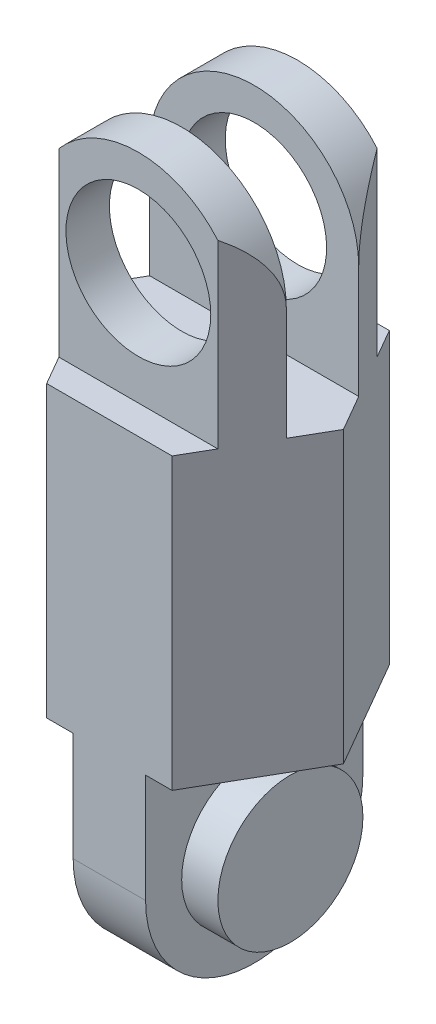
ISO-10303-21;
HEADER;
FILE_DESCRIPTION(('STEP AP214'),'2;1');
FILE_NAME('part.step','',(''),(''),'','','');
FILE_SCHEMA(('AUTOMOTIVE_DESIGN { 1 0 10303 214 1 1 1 1 }'));
ENDSEC;
DATA;
#1=APPLICATION_CONTEXT('core data for automotive mechanical design processes');
#2=APPLICATION_PROTOCOL_DEFINITION('international standard','automotive_design',2000,#1);
#3=PRODUCT_CONTEXT('',#1,'mechanical');
#4=PRODUCT('Part','Part','',(#3));
#5=PRODUCT_RELATED_PRODUCT_CATEGORY('part','',(#4));
#6=PRODUCT_DEFINITION_FORMATION('','',#4);
#7=PRODUCT_DEFINITION_CONTEXT('part definition',#1,'design');
#8=PRODUCT_DEFINITION('design','',#6,#7);
#9=PRODUCT_DEFINITION_SHAPE('','',#8);
#10=(LENGTH_UNIT() NAMED_UNIT(*) SI_UNIT(.MILLI.,.METRE.));
#11=(NAMED_UNIT(*) PLANE_ANGLE_UNIT() SI_UNIT($,.RADIAN.));
#12=(NAMED_UNIT(*) SI_UNIT($,.STERADIAN.) SOLID_ANGLE_UNIT());
#13=UNCERTAINTY_MEASURE_WITH_UNIT(LENGTH_MEASURE(1.E-05),#10,'distance_accuracy_value','');
#14=(GEOMETRIC_REPRESENTATION_CONTEXT(3) GLOBAL_UNCERTAINTY_ASSIGNED_CONTEXT((#13)) GLOBAL_UNIT_ASSIGNED_CONTEXT((#10,
#11,#12)) REPRESENTATION_CONTEXT('',''));
#15=CARTESIAN_POINT('',(0.,0.,0.));
#16=DIRECTION('',(0.,0.,1.));
#17=DIRECTION('',(1.,0.,0.));
#18=AXIS2_PLACEMENT_3D('',#15,#16,#17);
#19=CARTESIAN_POINT('',(-17.3205080756888,50.,11.));
#20=DIRECTION('',(0.,0.,-1.));
#21=DIRECTION('',(0.,1.,0.));
#22=AXIS2_PLACEMENT_3D('',#19,#20,#21);
#23=PLANE('',#22);
#24=CARTESIAN_POINT('',(0.,35.5662432702593,11.));
#25=DIRECTION('',(0.,0.,-1.));
#26=DIRECTION('',(0.,1.,0.));
#27=AXIS2_PLACEMENT_3D('',#24,#25,#26);
#28=CIRCLE('',#27,14.4337567297407);
#29=CARTESIAN_POINT('',(10.9696551146029,44.9470747899062,11.));
#30=VERTEX_POINT('',#29);
#31=CARTESIAN_POINT('',(-10.9696551146029,44.9470747899063,11.));
#32=VERTEX_POINT('',#31);
#33=EDGE_CURVE('E171',#30,#32,#28,.F.);
#34=ORIENTED_EDGE('',*,*,#33,.T.);
#35=DIRECTION('',(0.,1.,0.));
#36=VECTOR('',#35,1.);
#37=CARTESIAN_POINT('',(-10.9696551146029,50.,11.));
#38=LINE('',#37,#36);
#39=CARTESIAN_POINT('',(-10.9696551146029,20.,11.));
#40=VERTEX_POINT('',#39);
#41=EDGE_CURVE('E207',#40,#32,#38,.T.);
#42=ORIENTED_EDGE('',*,*,#41,.F.);
#43=DIRECTION('',(1.,0.,0.));
#44=VECTOR('',#43,1.);
#45=CARTESIAN_POINT('',(-17.3205080756888,20.,11.));
#46=LINE('',#45,#44);
#47=CARTESIAN_POINT('',(10.9696551146029,20.,11.));
#48=VERTEX_POINT('',#47);
#49=EDGE_CURVE('E382',#40,#48,#46,.T.);
#50=ORIENTED_EDGE('',*,*,#49,.T.);
#51=DIRECTION('',(0.,-1.,0.));
#52=VECTOR('',#51,1.);
#53=CARTESIAN_POINT('',(10.9696551146029,50.,11.));
#54=LINE('',#53,#52);
#55=EDGE_CURVE('E204',#30,#48,#54,.T.);
#56=ORIENTED_EDGE('',*,*,#55,.F.);
#57=EDGE_LOOP('',(#34,#42,#50,#56));
#58=FACE_BOUND('',#57,.T.);
#59=CARTESIAN_POINT('',(0.,35.5662432702593,11.));
#60=DIRECTION('',(0.,0.,-1.));
#61=DIRECTION('',(0.,1.,0.));
#62=AXIS2_PLACEMENT_3D('',#59,#60,#61);
#63=CIRCLE('',#62,10.);
#64=CARTESIAN_POINT('',(0.,45.5662432702593,11.));
#65=VERTEX_POINT('',#64);
#66=EDGE_CURVE('E408',#65,#65,#63,.T.);
#67=ORIENTED_EDGE('',*,*,#66,.T.);
#68=EDGE_LOOP('',(#67));
#69=FACE_BOUND('',#68,.T.);
#70=ADVANCED_FACE('F39',(#58,#69),#23,.F.);
#71=CARTESIAN_POINT('',(-17.3205080756888,50.,-11.0000000000001));
#72=DIRECTION('',(0.,0.,1.));
#73=DIRECTION('',(0.,-1.,0.));
#74=AXIS2_PLACEMENT_3D('',#71,#72,#73);
#75=PLANE('',#74);
#76=DIRECTION('',(0.,-1.,0.));
#77=VECTOR('',#76,1.);
#78=CARTESIAN_POINT('',(-10.9696551146029,50.,-11.0000000000001));
#79=LINE('',#78,#77);
#80=CARTESIAN_POINT('',(-10.9696551146029,44.9470747899062,-11.0000000000001));
#81=VERTEX_POINT('',#80);
#82=CARTESIAN_POINT('',(-10.9696551146029,20.,-11.0000000000001));
#83=VERTEX_POINT('',#82);
#84=EDGE_CURVE('E213',#81,#83,#79,.T.);
#85=ORIENTED_EDGE('',*,*,#84,.F.);
#86=CARTESIAN_POINT('',(0.,35.5662432702593,-11.0000000000001));
#87=DIRECTION('',(0.,0.,1.));
#88=DIRECTION('',(0.,-1.,0.));
#89=AXIS2_PLACEMENT_3D('',#86,#87,#88);
#90=CIRCLE('',#89,14.4337567297407);
#91=CARTESIAN_POINT('',(10.9696551146028,44.9470747899063,-11.0000000000001));
#92=VERTEX_POINT('',#91);
#93=EDGE_CURVE('E11',#81,#92,#90,.F.);
#94=ORIENTED_EDGE('',*,*,#93,.T.);
#95=DIRECTION('',(0.,1.,0.));
#96=VECTOR('',#95,1.);
#97=CARTESIAN_POINT('',(10.9696551146028,50.,-11.0000000000001));
#98=LINE('',#97,#96);
#99=CARTESIAN_POINT('',(10.9696551146028,20.,-11.0000000000001));
#100=VERTEX_POINT('',#99);
#101=EDGE_CURVE('E180',#100,#92,#98,.T.);
#102=ORIENTED_EDGE('',*,*,#101,.F.);
#103=DIRECTION('',(1.,0.,0.));
#104=VECTOR('',#103,1.);
#105=CARTESIAN_POINT('',(-17.3205080756888,20.,-11.0000000000001));
#106=LINE('',#105,#104);
#107=EDGE_CURVE('E395',#83,#100,#106,.T.);
#108=ORIENTED_EDGE('',*,*,#107,.F.);
#109=EDGE_LOOP('',(#85,#94,#102,#108));
#110=FACE_BOUND('',#109,.T.);
#111=CARTESIAN_POINT('',(0.,35.5662432702593,-11.0000000000001));
#112=DIRECTION('',(0.,0.,1.));
#113=DIRECTION('',(0.,-1.,0.));
#114=AXIS2_PLACEMENT_3D('',#111,#112,#113);
#115=CIRCLE('',#114,10.);
#116=CARTESIAN_POINT('',(0.,25.5662432702593,-11.0000000000001));
#117=VERTEX_POINT('',#116);
#118=EDGE_CURVE('E43',#117,#117,#115,.T.);
#119=ORIENTED_EDGE('',*,*,#118,.T.);
#120=EDGE_LOOP('',(#119));
#121=FACE_BOUND('',#120,.T.);
#122=ADVANCED_FACE('F432',(#110,#121),#75,.F.);
#123=CARTESIAN_POINT('',(-8.66025403784435,50.,15.));
#124=DIRECTION('',(0.,0.,-1.));
#125=DIRECTION('',(-1.,0.,0.));
#126=AXIS2_PLACEMENT_3D('',#123,#124,#125);
#127=PLANE('',#126);
#128=DIRECTION('',(0.,-1.,0.));
#129=VECTOR('',#128,1.);
#130=CARTESIAN_POINT('',(8.66025403784445,50.,15.));
#131=LINE('',#130,#129);
#132=CARTESIAN_POINT('',(8.66025403784445,20.,15.));
#133=VERTEX_POINT('',#132);
#134=CARTESIAN_POINT('',(8.66025403784445,-20.,15.));
#135=VERTEX_POINT('',#134);
#136=EDGE_CURVE('E324',#133,#135,#131,.T.);
#137=ORIENTED_EDGE('',*,*,#136,.F.);
#138=DIRECTION('',(1.,0.,0.));
#139=VECTOR('',#138,1.);
#140=CARTESIAN_POINT('',(-17.3205080756888,20.,15.));
#141=LINE('',#140,#139);
#142=CARTESIAN_POINT('',(-8.66025403784439,20.,15.));
#143=VERTEX_POINT('',#142);
#144=EDGE_CURVE('E357',#143,#133,#141,.T.);
#145=ORIENTED_EDGE('',*,*,#144,.F.);
#146=DIRECTION('',(0.,-1.,0.));
#147=VECTOR('',#146,1.);
#148=CARTESIAN_POINT('',(-8.66025403784435,50.,15.));
#149=LINE('',#148,#147);
#150=CARTESIAN_POINT('',(-8.66025403784435,-20.,15.));
#151=VERTEX_POINT('',#150);
#152=EDGE_CURVE('E327',#143,#151,#149,.T.);
#153=ORIENTED_EDGE('',*,*,#152,.T.);
#154=DIRECTION('',(-1.,0.,0.));
#155=VECTOR('',#154,1.);
#156=CARTESIAN_POINT('',(-17.3205080756888,-20.,15.));
#157=LINE('',#156,#155);
#158=CARTESIAN_POINT('',(-5.,-20.,15.));
#159=VERTEX_POINT('',#158);
#160=EDGE_CURVE('E266',#159,#151,#157,.T.);
#161=ORIENTED_EDGE('',*,*,#160,.F.);
#162=DIRECTION('',(0.,1.,0.));
#163=VECTOR('',#162,1.);
#164=CARTESIAN_POINT('',(-5.,-50.,15.));
#165=LINE('',#164,#163);
#166=CARTESIAN_POINT('',(-5.,-35.,15.));
#167=VERTEX_POINT('',#166);
#168=EDGE_CURVE('E263',#167,#159,#165,.T.);
#169=ORIENTED_EDGE('',*,*,#168,.F.);
#170=DIRECTION('',(1.,0.,0.));
#171=VECTOR('',#170,1.);
#172=CARTESIAN_POINT('',(-17.3205080756888,-35.,15.));
#173=LINE('',#172,#171);
#174=CARTESIAN_POINT('',(5.,-35.,15.));
#175=VERTEX_POINT('',#174);
#176=EDGE_CURVE('E63',#167,#175,#173,.T.);
#177=ORIENTED_EDGE('',*,*,#176,.T.);
#178=DIRECTION('',(0.,-1.,0.));
#179=VECTOR('',#178,1.);
#180=CARTESIAN_POINT('',(5.,-50.,15.));
#181=LINE('',#180,#179);
#182=CARTESIAN_POINT('',(5.,-20.,15.));
#183=VERTEX_POINT('',#182);
#184=EDGE_CURVE('E285',#183,#175,#181,.T.);
#185=ORIENTED_EDGE('',*,*,#184,.F.);
#186=DIRECTION('',(-1.,0.,0.));
#187=VECTOR('',#186,1.);
#188=CARTESIAN_POINT('',(17.3205080756888,-20.,15.));
#189=LINE('',#188,#187);
#190=EDGE_CURVE('E262',#135,#183,#189,.T.);
#191=ORIENTED_EDGE('',*,*,#190,.F.);
#192=EDGE_LOOP('',(#137,#145,#153,#161,#169,#177,#185,#191));
#193=FACE_BOUND('',#192,.T.);
#194=ADVANCED_FACE('F356',(#193),#127,.F.);
#195=CARTESIAN_POINT('',(-8.66025403784456,50.,-14.9999999999999));
#196=DIRECTION('',(0.866025403784442,0.,0.499999999999995));
#197=DIRECTION('',(0.499999999999995,0.,-0.866025403784441));
#198=AXIS2_PLACEMENT_3D('',#195,#196,#197);
#199=PLANE('',#198);
#200=DIRECTION('',(0.,1.,0.));
#201=VECTOR('',#200,1.);
#202=CARTESIAN_POINT('',(-14.4337567297406,50.,-5.00000000000012));
#203=LINE('',#202,#201);
#204=CARTESIAN_POINT('',(-14.4337567297406,20.,-5.00000000000012));
#205=VERTEX_POINT('',#204);
#206=CARTESIAN_POINT('',(-14.4337567297407,35.5662432702593,-5.00000000000012));
#207=VERTEX_POINT('',#206);
#208=EDGE_CURVE('E188',#205,#207,#203,.T.);
#209=ORIENTED_EDGE('',*,*,#208,.T.);
#210=CARTESIAN_POINT('',(0.,35.5662432702593,-30.0000000000004));
#211=DIRECTION('',(0.866025403784442,0.,0.499999999999995));
#212=DIRECTION('',(-0.499999999999995,0.,0.866025403784441));
#213=AXIS2_PLACEMENT_3D('',#210,#211,#212);
#214=ELLIPSE('',#213,28.8675134594817,14.4337567297407);
#215=EDGE_CURVE('E166',#207,#81,#214,.F.);
#216=ORIENTED_EDGE('',*,*,#215,.T.);
#217=ORIENTED_EDGE('',*,*,#84,.T.);
#218=DIRECTION('',(0.499999999999995,0.,-0.866025403784441));
#219=VECTOR('',#218,1.);
#220=CARTESIAN_POINT('',(-8.66025403784456,20.,-14.9999999999999));
#221=LINE('',#220,#219);
#222=CARTESIAN_POINT('',(-8.66025403784456,20.,-15.0000000000001));
#223=VERTEX_POINT('',#222);
#224=EDGE_CURVE('E219',#83,#223,#221,.T.);
#225=ORIENTED_EDGE('',*,*,#224,.T.);
#226=DIRECTION('',(0.,-1.,0.));
#227=VECTOR('',#226,1.);
#228=CARTESIAN_POINT('',(-8.66025403784456,50.,-14.9999999999999));
#229=LINE('',#228,#227);
#230=CARTESIAN_POINT('',(-8.66025403784456,-20.,-15.0000000000001));
#231=VERTEX_POINT('',#230);
#232=EDGE_CURVE('E315',#223,#231,#229,.T.);
#233=ORIENTED_EDGE('',*,*,#232,.T.);
#234=DIRECTION('',(-0.499999999999995,0.,0.866025403784442));
#235=VECTOR('',#234,1.);
#236=CARTESIAN_POINT('',(-8.66025403784456,-20.,-14.9999999999999));
#237=LINE('',#236,#235);
#238=CARTESIAN_POINT('',(-17.3205080756888,-20.,0.));
#239=VERTEX_POINT('',#238);
#240=EDGE_CURVE('E311',#231,#239,#237,.T.);
#241=ORIENTED_EDGE('',*,*,#240,.T.);
#242=DIRECTION('',(0.,-1.,0.));
#243=VECTOR('',#242,1.);
#244=CARTESIAN_POINT('',(-17.3205080756888,50.,0.));
#245=LINE('',#244,#243);
#246=CARTESIAN_POINT('',(-17.3205080756888,20.,0.));
#247=VERTEX_POINT('',#246);
#248=EDGE_CURVE('E330',#247,#239,#245,.T.);
#249=ORIENTED_EDGE('',*,*,#248,.F.);
#250=DIRECTION('',(0.499999999999995,0.,-0.866025403784441));
#251=VECTOR('',#250,1.);
#252=CARTESIAN_POINT('',(-8.66025403784456,20.,-14.9999999999999));
#253=LINE('',#252,#251);
#254=EDGE_CURVE('E231',#247,#205,#253,.T.);
#255=ORIENTED_EDGE('',*,*,#254,.T.);
#256=EDGE_LOOP('',(#209,#216,#217,#225,#233,#241,#249,#255));
#257=FACE_BOUND('',#256,.T.);
#258=ADVANCED_FACE('F41',(#257),#199,.F.);
#259=CARTESIAN_POINT('',(-17.3205080756888,50.,0.));
#260=DIRECTION('',(0.866025403784438,0.,-0.500000000000001));
#261=DIRECTION('',(-0.500000000000001,0.,-0.866025403784438));
#262=AXIS2_PLACEMENT_3D('',#259,#260,#261);
#263=PLANE('',#262);
#264=ORIENTED_EDGE('',*,*,#41,.T.);
#265=CARTESIAN_POINT('',(0.,35.5662432702593,29.9999999999999));
#266=DIRECTION('',(0.866025403784438,0.,-0.500000000000001));
#267=DIRECTION('',(0.500000000000001,0.,0.866025403784438));
#268=AXIS2_PLACEMENT_3D('',#265,#266,#267);
#269=ELLIPSE('',#268,28.8675134594813,14.4337567297407);
#270=CARTESIAN_POINT('',(-14.4337567297407,35.5662432702593,4.99999999999988));
#271=VERTEX_POINT('',#270);
#272=EDGE_CURVE('E419',#32,#271,#269,.F.);
#273=ORIENTED_EDGE('',*,*,#272,.T.);
#274=DIRECTION('',(0.,-1.,0.));
#275=VECTOR('',#274,1.);
#276=CARTESIAN_POINT('',(-14.4337567297407,50.,4.99999999999988));
#277=LINE('',#276,#275);
#278=CARTESIAN_POINT('',(-14.4337567297407,20.,4.99999999999988));
#279=VERTEX_POINT('',#278);
#280=EDGE_CURVE('E201',#271,#279,#277,.T.);
#281=ORIENTED_EDGE('',*,*,#280,.T.);
#282=DIRECTION('',(-0.500000000000001,0.,-0.866025403784438));
#283=VECTOR('',#282,1.);
#284=CARTESIAN_POINT('',(-17.3205080756888,20.,0.));
#285=LINE('',#284,#283);
#286=EDGE_CURVE('E227',#279,#247,#285,.T.);
#287=ORIENTED_EDGE('',*,*,#286,.T.);
#288=ORIENTED_EDGE('',*,*,#248,.T.);
#289=DIRECTION('',(0.500000000000001,0.,0.866025403784438));
#290=VECTOR('',#289,1.);
#291=CARTESIAN_POINT('',(-17.3205080756888,-20.,0.));
#292=LINE('',#291,#290);
#293=EDGE_CURVE('E307',#239,#151,#292,.T.);
#294=ORIENTED_EDGE('',*,*,#293,.T.);
#295=ORIENTED_EDGE('',*,*,#152,.F.);
#296=DIRECTION('',(-0.500000000000001,0.,-0.866025403784438));
#297=VECTOR('',#296,1.);
#298=CARTESIAN_POINT('',(-17.3205080756888,20.,0.));
#299=LINE('',#298,#297);
#300=EDGE_CURVE('E235',#143,#40,#299,.T.);
#301=ORIENTED_EDGE('',*,*,#300,.T.);
#302=EDGE_LOOP('',(#264,#273,#281,#287,#288,#294,#295,#301));
#303=FACE_BOUND('',#302,.T.);
#304=ADVANCED_FACE('F508',(#303),#263,.F.);
#305=CARTESIAN_POINT('',(8.66025403784445,50.,15.));
#306=DIRECTION('',(-0.866025403784442,0.,-0.499999999999995));
#307=DIRECTION('',(-0.499999999999995,0.,0.866025403784442));
#308=AXIS2_PLACEMENT_3D('',#305,#306,#307);
#309=PLANE('',#308);
#310=DIRECTION('',(0.,1.,0.));
#311=VECTOR('',#310,1.);
#312=CARTESIAN_POINT('',(14.4337567297407,50.,4.99999999999988));
#313=LINE('',#312,#311);
#314=CARTESIAN_POINT('',(14.4337567297407,20.,4.99999999999988));
#315=VERTEX_POINT('',#314);
#316=CARTESIAN_POINT('',(14.4337567297407,35.5662432702593,4.99999999999988));
#317=VERTEX_POINT('',#316);
#318=EDGE_CURVE('E192',#315,#317,#313,.T.);
#319=ORIENTED_EDGE('',*,*,#318,.T.);
#320=CARTESIAN_POINT('',(0.,35.5662432702593,30.0000000000003));
#321=DIRECTION('',(-0.866025403784442,0.,-0.499999999999995));
#322=DIRECTION('',(-0.499999999999995,0.,0.866025403784442));
#323=AXIS2_PLACEMENT_3D('',#320,#321,#322);
#324=ELLIPSE('',#323,28.8675134594817,14.4337567297407);
#325=EDGE_CURVE('E423',#317,#30,#324,.F.);
#326=ORIENTED_EDGE('',*,*,#325,.T.);
#327=ORIENTED_EDGE('',*,*,#55,.T.);
#328=DIRECTION('',(-0.499999999999995,0.,0.866025403784442));
#329=VECTOR('',#328,1.);
#330=CARTESIAN_POINT('',(8.66025403784445,20.,15.));
#331=LINE('',#330,#329);
#332=EDGE_CURVE('E49',#48,#133,#331,.T.);
#333=ORIENTED_EDGE('',*,*,#332,.T.);
#334=ORIENTED_EDGE('',*,*,#136,.T.);
#335=DIRECTION('',(0.499999999999995,0.,-0.866025403784442));
#336=VECTOR('',#335,1.);
#337=CARTESIAN_POINT('',(8.66025403784445,-20.,15.));
#338=LINE('',#337,#336);
#339=CARTESIAN_POINT('',(17.3205080756888,-20.,-1.24406136667926E-13));
#340=VERTEX_POINT('',#339);
#341=EDGE_CURVE('E303',#135,#340,#338,.T.);
#342=ORIENTED_EDGE('',*,*,#341,.T.);
#343=DIRECTION('',(0.,-1.,0.));
#344=VECTOR('',#343,1.);
#345=CARTESIAN_POINT('',(17.3205080756888,50.,-1.20948461451098E-13));
#346=LINE('',#345,#344);
#347=CARTESIAN_POINT('',(17.3205080756888,20.,-1.20563281580388E-13));
#348=VERTEX_POINT('',#347);
#349=EDGE_CURVE('E321',#348,#340,#346,.T.);
#350=ORIENTED_EDGE('',*,*,#349,.F.);
#351=DIRECTION('',(-0.499999999999995,0.,0.866025403784442));
#352=VECTOR('',#351,1.);
#353=CARTESIAN_POINT('',(8.66025403784445,20.,15.));
#354=LINE('',#353,#352);
#355=EDGE_CURVE('E223',#348,#315,#354,.T.);
#356=ORIENTED_EDGE('',*,*,#355,.T.);
#357=EDGE_LOOP('',(#319,#326,#327,#333,#334,#342,#350,#356));
#358=FACE_BOUND('',#357,.T.);
#359=ADVANCED_FACE('F346',(#358),#309,.F.);
#360=CARTESIAN_POINT('',(17.3205080756888,50.,-1.20948461451098E-13));
#361=DIRECTION('',(-0.866025403784435,0.,0.500000000000007));
#362=DIRECTION('',(0.500000000000007,0.,0.866025403784435));
#363=AXIS2_PLACEMENT_3D('',#360,#361,#362);
#364=PLANE('',#363);
#365=ORIENTED_EDGE('',*,*,#101,.T.);
#366=CARTESIAN_POINT('',(0.,35.5662432702593,-29.9999999999996));
#367=DIRECTION('',(-0.866025403784435,0.,0.500000000000007));
#368=DIRECTION('',(0.500000000000007,0.,0.866025403784435));
#369=AXIS2_PLACEMENT_3D('',#366,#367,#368);
#370=ELLIPSE('',#369,28.867513459481,14.4337567297407);
#371=CARTESIAN_POINT('',(14.4337567297407,35.5662432702593,-5.00000000000012));
#372=VERTEX_POINT('',#371);
#373=EDGE_CURVE('E56',#92,#372,#370,.F.);
#374=ORIENTED_EDGE('',*,*,#373,.T.);
#375=DIRECTION('',(0.,-1.,0.));
#376=VECTOR('',#375,1.);
#377=CARTESIAN_POINT('',(14.4337567297406,50.,-5.00000000000012));
#378=LINE('',#377,#376);
#379=CARTESIAN_POINT('',(14.4337567297406,20.,-5.00000000000012));
#380=VERTEX_POINT('',#379);
#381=EDGE_CURVE('E177',#372,#380,#378,.T.);
#382=ORIENTED_EDGE('',*,*,#381,.T.);
#383=DIRECTION('',(0.500000000000007,0.,0.866025403784435));
#384=VECTOR('',#383,1.);
#385=CARTESIAN_POINT('',(17.3205080756888,20.,-1.20948461451098E-13));
#386=LINE('',#385,#384);
#387=EDGE_CURVE('E251',#380,#348,#386,.T.);
#388=ORIENTED_EDGE('',*,*,#387,.T.);
#389=ORIENTED_EDGE('',*,*,#349,.T.);
#390=DIRECTION('',(-0.500000000000007,0.,-0.866025403784435));
#391=VECTOR('',#390,1.);
#392=CARTESIAN_POINT('',(17.3205080756888,-20.,-1.20948461451098E-13));
#393=LINE('',#392,#391);
#394=CARTESIAN_POINT('',(8.66025403784424,-20.,-15.0000000000001));
#395=VERTEX_POINT('',#394);
#396=EDGE_CURVE('E282',#340,#395,#393,.T.);
#397=ORIENTED_EDGE('',*,*,#396,.T.);
#398=DIRECTION('',(0.,-1.,0.));
#399=VECTOR('',#398,1.);
#400=CARTESIAN_POINT('',(8.66025403784424,50.,-15.0000000000001));
#401=LINE('',#400,#399);
#402=CARTESIAN_POINT('',(8.66025403784424,20.,-15.0000000000001));
#403=VERTEX_POINT('',#402);
#404=EDGE_CURVE('E318',#403,#395,#401,.T.);
#405=ORIENTED_EDGE('',*,*,#404,.F.);
#406=DIRECTION('',(0.500000000000007,0.,0.866025403784435));
#407=VECTOR('',#406,1.);
#408=CARTESIAN_POINT('',(17.3205080756888,20.,-1.20948461451098E-13));
#409=LINE('',#408,#407);
#410=EDGE_CURVE('E216',#403,#100,#409,.T.);
#411=ORIENTED_EDGE('',*,*,#410,.T.);
#412=EDGE_LOOP('',(#365,#374,#382,#388,#389,#397,#405,#411));
#413=FACE_BOUND('',#412,.T.);
#414=ADVANCED_FACE('F175',(#413),#364,.F.);
#415=CARTESIAN_POINT('',(8.66025403784424,50.,-15.0000000000001));
#416=DIRECTION('',(0.,0.,1.));
#417=DIRECTION('',(1.,0.,0.));
#418=AXIS2_PLACEMENT_3D('',#415,#416,#417);
#419=PLANE('',#418);
#420=ORIENTED_EDGE('',*,*,#232,.F.);
#421=DIRECTION('',(1.,0.,0.));
#422=VECTOR('',#421,1.);
#423=CARTESIAN_POINT('',(-17.3205080756888,20.,-15.0000000000001));
#424=LINE('',#423,#422);
#425=EDGE_CURVE('E387',#223,#403,#424,.T.);
#426=ORIENTED_EDGE('',*,*,#425,.T.);
#427=ORIENTED_EDGE('',*,*,#404,.T.);
#428=DIRECTION('',(-1.,0.,0.));
#429=VECTOR('',#428,1.);
#430=CARTESIAN_POINT('',(17.3205080756888,-20.,-15.0000000000001));
#431=LINE('',#430,#429);
#432=CARTESIAN_POINT('',(5.,-20.,-15.0000000000001));
#433=VERTEX_POINT('',#432);
#434=EDGE_CURVE('E289',#395,#433,#431,.T.);
#435=ORIENTED_EDGE('',*,*,#434,.T.);
#436=DIRECTION('',(0.,-1.,0.));
#437=VECTOR('',#436,1.);
#438=CARTESIAN_POINT('',(5.,-50.,-15.0000000000001));
#439=LINE('',#438,#437);
#440=CARTESIAN_POINT('',(5.,-35.,-15.0000000000001));
#441=VERTEX_POINT('',#440);
#442=EDGE_CURVE('E293',#433,#441,#439,.T.);
#443=ORIENTED_EDGE('',*,*,#442,.T.);
#444=DIRECTION('',(1.,0.,0.));
#445=VECTOR('',#444,1.);
#446=CARTESIAN_POINT('',(-17.3205080756888,-35.,-15.0000000000001));
#447=LINE('',#446,#445);
#448=CARTESIAN_POINT('',(-5.,-35.,-15.0000000000001));
#449=VERTEX_POINT('',#448);
#450=EDGE_CURVE('E253',#449,#441,#447,.T.);
#451=ORIENTED_EDGE('',*,*,#450,.F.);
#452=DIRECTION('',(0.,1.,0.));
#453=VECTOR('',#452,1.);
#454=CARTESIAN_POINT('',(-5.,-50.,-15.0000000000001));
#455=LINE('',#454,#453);
#456=CARTESIAN_POINT('',(-5.,-20.,-15.0000000000001));
#457=VERTEX_POINT('',#456);
#458=EDGE_CURVE('E271',#449,#457,#455,.T.);
#459=ORIENTED_EDGE('',*,*,#458,.T.);
#460=DIRECTION('',(-1.,0.,0.));
#461=VECTOR('',#460,1.);
#462=CARTESIAN_POINT('',(-17.3205080756888,-20.,-15.0000000000001));
#463=LINE('',#462,#461);
#464=EDGE_CURVE('E274',#457,#231,#463,.T.);
#465=ORIENTED_EDGE('',*,*,#464,.T.);
#466=EDGE_LOOP('',(#420,#426,#427,#435,#443,#451,#459,#465));
#467=FACE_BOUND('',#466,.T.);
#468=ADVANCED_FACE('F370',(#467),#419,.F.);
#469=CARTESIAN_POINT('',(17.3205080756888,-20.,-15.0000000000001));
#470=DIRECTION('',(0.,1.,0.));
#471=DIRECTION('',(0.,0.,1.));
#472=AXIS2_PLACEMENT_3D('',#469,#470,#471);
#473=PLANE('',#472);
#474=ORIENTED_EDGE('',*,*,#190,.T.);
#475=DIRECTION('',(0.,0.,1.));
#476=VECTOR('',#475,1.);
#477=CARTESIAN_POINT('',(5.,-20.,-15.0000000000001));
#478=LINE('',#477,#476);
#479=EDGE_CURVE('E267',#433,#183,#478,.T.);
#480=ORIENTED_EDGE('',*,*,#479,.F.);
#481=ORIENTED_EDGE('',*,*,#434,.F.);
#482=ORIENTED_EDGE('',*,*,#396,.F.);
#483=ORIENTED_EDGE('',*,*,#341,.F.);
#484=EDGE_LOOP('',(#474,#480,#481,#482,#483));
#485=FACE_BOUND('',#484,.T.);
#486=ADVANCED_FACE('F361',(#485),#473,.F.);
#487=CARTESIAN_POINT('',(5.,-50.,-15.0000000000001));
#488=DIRECTION('',(-1.,0.,0.));
#489=DIRECTION('',(0.,0.,1.));
#490=AXIS2_PLACEMENT_3D('',#487,#488,#489);
#491=PLANE('',#490);
#492=CARTESIAN_POINT('',(5.,-35.,0.));
#493=DIRECTION('',(-1.,0.,0.));
#494=DIRECTION('',(0.,0.,1.));
#495=AXIS2_PLACEMENT_3D('',#492,#493,#494);
#496=CIRCLE('',#495,10.015435759768);
#497=CARTESIAN_POINT('',(5.,-35.,10.0154357597679));
#498=VERTEX_POINT('',#497);
#499=EDGE_CURVE('E247',#498,#498,#496,.F.);
#500=ORIENTED_EDGE('',*,*,#499,.F.);
#501=EDGE_LOOP('',(#500));
#502=FACE_BOUND('',#501,.T.);
#503=ORIENTED_EDGE('',*,*,#184,.T.);
#504=CARTESIAN_POINT('',(5.,-35.,0.));
#505=DIRECTION('',(-1.,0.,0.));
#506=DIRECTION('',(0.,0.,1.));
#507=AXIS2_PLACEMENT_3D('',#504,#505,#506);
#508=CIRCLE('',#507,15.);
#509=EDGE_CURVE('E257',#175,#441,#508,.F.);
#510=ORIENTED_EDGE('',*,*,#509,.T.);
#511=ORIENTED_EDGE('',*,*,#442,.F.);
#512=ORIENTED_EDGE('',*,*,#479,.T.);
#513=EDGE_LOOP('',(#503,#510,#511,#512));
#514=FACE_BOUND('',#513,.T.);
#515=ADVANCED_FACE('F366',(#502,#514),#491,.F.);
#516=CARTESIAN_POINT('',(-17.3205080756888,-20.,-15.0000000000001));
#517=DIRECTION('',(0.,1.,0.));
#518=DIRECTION('',(0.,0.,1.));
#519=AXIS2_PLACEMENT_3D('',#516,#517,#518);
#520=PLANE('',#519);
#521=ORIENTED_EDGE('',*,*,#464,.F.);
#522=DIRECTION('',(0.,0.,1.));
#523=VECTOR('',#522,1.);
#524=CARTESIAN_POINT('',(-5.,-20.,-15.0000000000001));
#525=LINE('',#524,#523);
#526=EDGE_CURVE('E278',#457,#159,#525,.T.);
#527=ORIENTED_EDGE('',*,*,#526,.T.);
#528=ORIENTED_EDGE('',*,*,#160,.T.);
#529=ORIENTED_EDGE('',*,*,#293,.F.);
#530=ORIENTED_EDGE('',*,*,#240,.F.);
#531=EDGE_LOOP('',(#521,#527,#528,#529,#530));
#532=FACE_BOUND('',#531,.T.);
#533=ADVANCED_FACE('F490',(#532),#520,.F.);
#534=CARTESIAN_POINT('',(-5.,-50.,-15.0000000000001));
#535=DIRECTION('',(1.,0.,0.));
#536=DIRECTION('',(0.,0.,-1.));
#537=AXIS2_PLACEMENT_3D('',#534,#535,#536);
#538=PLANE('',#537);
#539=CARTESIAN_POINT('',(-5.,-35.,0.));
#540=DIRECTION('',(1.,0.,0.));
#541=DIRECTION('',(0.,0.,-1.));
#542=AXIS2_PLACEMENT_3D('',#539,#540,#541);
#543=CIRCLE('',#542,10.015435759768);
#544=CARTESIAN_POINT('',(-5.,-35.,-10.015435759768));
#545=VERTEX_POINT('',#544);
#546=EDGE_CURVE('E252',#545,#545,#543,.F.);
#547=ORIENTED_EDGE('',*,*,#546,.F.);
#548=EDGE_LOOP('',(#547));
#549=FACE_BOUND('',#548,.T.);
#550=ORIENTED_EDGE('',*,*,#458,.F.);
#551=CARTESIAN_POINT('',(-5.,-35.,0.));
#552=DIRECTION('',(1.,0.,0.));
#553=DIRECTION('',(0.,0.,-1.));
#554=AXIS2_PLACEMENT_3D('',#551,#552,#553);
#555=CIRCLE('',#554,15.);
#556=EDGE_CURVE('E333',#449,#167,#555,.F.);
#557=ORIENTED_EDGE('',*,*,#556,.T.);
#558=ORIENTED_EDGE('',*,*,#168,.T.);
#559=ORIENTED_EDGE('',*,*,#526,.F.);
#560=EDGE_LOOP('',(#550,#557,#558,#559));
#561=FACE_BOUND('',#560,.T.);
#562=ADVANCED_FACE('F489',(#549,#561),#538,.F.);
#563=CARTESIAN_POINT('',(-17.3205080756888,-35.,0.));
#564=DIRECTION('',(1.,0.,0.));
#565=DIRECTION('',(0.,0.,-1.));
#566=AXIS2_PLACEMENT_3D('',#563,#564,#565);
#567=CYLINDRICAL_SURFACE('',#566,15.);
#568=ORIENTED_EDGE('',*,*,#509,.F.);
#569=ORIENTED_EDGE('',*,*,#176,.F.);
#570=ORIENTED_EDGE('',*,*,#556,.F.);
#571=ORIENTED_EDGE('',*,*,#450,.T.);
#572=EDGE_LOOP('',(#568,#569,#570,#571));
#573=FACE_BOUND('',#572,.T.);
#574=ADVANCED_FACE('F482',(#573),#567,.T.);
#575=CARTESIAN_POINT('',(-10.,-35.,0.));
#576=DIRECTION('',(1.,0.,0.));
#577=DIRECTION('',(0.,0.,-1.));
#578=AXIS2_PLACEMENT_3D('',#575,#576,#577);
#579=PLANE('',#578);
#580=CARTESIAN_POINT('',(-10.,-35.,0.));
#581=DIRECTION('',(1.,0.,0.));
#582=DIRECTION('',(0.,0.,-1.));
#583=AXIS2_PLACEMENT_3D('',#580,#581,#582);
#584=CIRCLE('',#583,10.015435759768);
#585=CARTESIAN_POINT('',(-10.,-35.,-10.015435759768));
#586=VERTEX_POINT('',#585);
#587=EDGE_CURVE('E239',#586,#586,#584,.T.);
#588=ORIENTED_EDGE('',*,*,#587,.F.);
#589=EDGE_LOOP('',(#588));
#590=FACE_BOUND('',#589,.T.);
#591=ADVANCED_FACE('F478',(#590),#579,.F.);
#592=CARTESIAN_POINT('',(10.,-35.,0.));
#593=DIRECTION('',(-1.,0.,0.));
#594=DIRECTION('',(0.,0.,1.));
#595=AXIS2_PLACEMENT_3D('',#592,#593,#594);
#596=CYLINDRICAL_SURFACE('',#595,10.015435759768);
#597=ORIENTED_EDGE('',*,*,#587,.T.);
#598=EDGE_LOOP('',(#597));
#599=FACE_BOUND('',#598,.T.);
#600=ORIENTED_EDGE('',*,*,#546,.T.);
#601=EDGE_LOOP('',(#600));
#602=FACE_BOUND('',#601,.T.);
#603=ADVANCED_FACE('F481',(#599,#602),#596,.T.);
#604=CARTESIAN_POINT('',(10.,-35.,0.));
#605=DIRECTION('',(1.,0.,0.));
#606=DIRECTION('',(0.,0.,-1.));
#607=AXIS2_PLACEMENT_3D('',#604,#605,#606);
#608=CIRCLE('',#607,10.015435759768);
#609=CARTESIAN_POINT('',(10.,-35.,-10.015435759768));
#610=VERTEX_POINT('',#609);
#611=EDGE_CURVE('E240',#610,#610,#608,.T.);
#612=ORIENTED_EDGE('',*,*,#611,.F.);
#613=EDGE_LOOP('',(#612));
#614=FACE_BOUND('',#613,.T.);
#615=ORIENTED_EDGE('',*,*,#499,.T.);
#616=EDGE_LOOP('',(#615));
#617=FACE_BOUND('',#616,.T.);
#618=ADVANCED_FACE('F476',(#614,#617),#596,.T.);
#619=CARTESIAN_POINT('',(10.,-35.,0.));
#620=DIRECTION('',(1.,0.,0.));
#621=DIRECTION('',(0.,0.,-1.));
#622=AXIS2_PLACEMENT_3D('',#619,#620,#621);
#623=PLANE('',#622);
#624=ORIENTED_EDGE('',*,*,#611,.T.);
#625=EDGE_LOOP('',(#624));
#626=FACE_BOUND('',#625,.T.);
#627=ADVANCED_FACE('F471',(#626),#623,.T.);
#628=CARTESIAN_POINT('',(-17.3205080756888,20.,-5.00000000000012));
#629=DIRECTION('',(0.,-1.,0.));
#630=DIRECTION('',(0.,0.,-1.));
#631=AXIS2_PLACEMENT_3D('',#628,#629,#630);
#632=PLANE('',#631);
#633=ORIENTED_EDGE('',*,*,#286,.F.);
#634=DIRECTION('',(1.,0.,0.));
#635=VECTOR('',#634,1.);
#636=CARTESIAN_POINT('',(-17.3205080756888,20.,4.99999999999988));
#637=LINE('',#636,#635);
#638=EDGE_CURVE('E194',#279,#315,#637,.T.);
#639=ORIENTED_EDGE('',*,*,#638,.T.);
#640=ORIENTED_EDGE('',*,*,#355,.F.);
#641=ORIENTED_EDGE('',*,*,#387,.F.);
#642=DIRECTION('',(1.,0.,0.));
#643=VECTOR('',#642,1.);
#644=CARTESIAN_POINT('',(-17.3205080756888,20.,-5.00000000000012));
#645=LINE('',#644,#643);
#646=EDGE_CURVE('E186',#205,#380,#645,.T.);
#647=ORIENTED_EDGE('',*,*,#646,.F.);
#648=ORIENTED_EDGE('',*,*,#254,.F.);
#649=EDGE_LOOP('',(#633,#639,#640,#641,#647,#648));
#650=FACE_BOUND('',#649,.T.);
#651=ADVANCED_FACE('F377',(#650),#632,.F.);
#652=CARTESIAN_POINT('',(-17.3205080756888,20.,4.99999999999988));
#653=DIRECTION('',(0.,0.,1.));
#654=DIRECTION('',(1.,0.,0.));
#655=AXIS2_PLACEMENT_3D('',#652,#653,#654);
#656=PLANE('',#655);
#657=CARTESIAN_POINT('',(0.,35.5662432702593,4.99999999999988));
#658=DIRECTION('',(0.,0.,1.));
#659=DIRECTION('',(1.,0.,0.));
#660=AXIS2_PLACEMENT_3D('',#657,#658,#659);
#661=CIRCLE('',#660,10.);
#662=CARTESIAN_POINT('',(9.99999999999998,35.5662432702593,4.99999999999988));
#663=VERTEX_POINT('',#662);
#664=EDGE_CURVE('E390',#663,#663,#661,.T.);
#665=ORIENTED_EDGE('',*,*,#664,.T.);
#666=EDGE_LOOP('',(#665));
#667=FACE_BOUND('',#666,.T.);
#668=ORIENTED_EDGE('',*,*,#280,.F.);
#669=CARTESIAN_POINT('',(0.,35.5662432702593,4.99999999999988));
#670=DIRECTION('',(0.,0.,1.));
#671=DIRECTION('',(1.,0.,0.));
#672=AXIS2_PLACEMENT_3D('',#669,#670,#671);
#673=CIRCLE('',#672,14.4337567297407);
#674=EDGE_CURVE('E415',#271,#317,#673,.F.);
#675=ORIENTED_EDGE('',*,*,#674,.T.);
#676=ORIENTED_EDGE('',*,*,#318,.F.);
#677=ORIENTED_EDGE('',*,*,#638,.F.);
#678=EDGE_LOOP('',(#668,#675,#676,#677));
#679=FACE_BOUND('',#678,.T.);
#680=ADVANCED_FACE('F468',(#667,#679),#656,.F.);
#681=CARTESIAN_POINT('',(-17.3205080756888,20.,-5.00000000000012));
#682=DIRECTION('',(0.,0.,-1.));
#683=DIRECTION('',(-1.,0.,0.));
#684=AXIS2_PLACEMENT_3D('',#681,#682,#683);
#685=PLANE('',#684);
#686=CARTESIAN_POINT('',(0.,35.5662432702593,-5.00000000000012));
#687=DIRECTION('',(0.,0.,-1.));
#688=DIRECTION('',(-1.,0.,0.));
#689=AXIS2_PLACEMENT_3D('',#686,#687,#688);
#690=CIRCLE('',#689,10.);
#691=CARTESIAN_POINT('',(-10.,35.5662432702593,-5.00000000000012));
#692=VERTEX_POINT('',#691);
#693=EDGE_CURVE('E403',#692,#692,#690,.T.);
#694=ORIENTED_EDGE('',*,*,#693,.T.);
#695=EDGE_LOOP('',(#694));
#696=FACE_BOUND('',#695,.T.);
#697=ORIENTED_EDGE('',*,*,#381,.F.);
#698=CARTESIAN_POINT('',(0.,35.5662432702593,-5.00000000000012));
#699=DIRECTION('',(0.,0.,-1.));
#700=DIRECTION('',(-1.,0.,0.));
#701=AXIS2_PLACEMENT_3D('',#698,#699,#700);
#702=CIRCLE('',#701,14.4337567297407);
#703=EDGE_CURVE('E163',#372,#207,#702,.F.);
#704=ORIENTED_EDGE('',*,*,#703,.T.);
#705=ORIENTED_EDGE('',*,*,#208,.F.);
#706=ORIENTED_EDGE('',*,*,#646,.T.);
#707=EDGE_LOOP('',(#697,#704,#705,#706));
#708=FACE_BOUND('',#707,.T.);
#709=ADVANCED_FACE('F184',(#696,#708),#685,.F.);
#710=CARTESIAN_POINT('',(-17.3205080756888,20.,15.));
#711=DIRECTION('',(0.,-1.,0.));
#712=DIRECTION('',(0.,0.,-1.));
#713=AXIS2_PLACEMENT_3D('',#710,#711,#712);
#714=PLANE('',#713);
#715=ORIENTED_EDGE('',*,*,#144,.T.);
#716=ORIENTED_EDGE('',*,*,#332,.F.);
#717=ORIENTED_EDGE('',*,*,#49,.F.);
#718=ORIENTED_EDGE('',*,*,#300,.F.);
#719=EDGE_LOOP('',(#715,#716,#717,#718));
#720=FACE_BOUND('',#719,.T.);
#721=ADVANCED_FACE('F461',(#720),#714,.F.);
#722=CARTESIAN_POINT('',(-17.3205080756888,20.,-15.0000000000001));
#723=DIRECTION('',(0.,-1.,0.));
#724=DIRECTION('',(0.,0.,-1.));
#725=AXIS2_PLACEMENT_3D('',#722,#723,#724);
#726=PLANE('',#725);
#727=ORIENTED_EDGE('',*,*,#107,.T.);
#728=ORIENTED_EDGE('',*,*,#410,.F.);
#729=ORIENTED_EDGE('',*,*,#425,.F.);
#730=ORIENTED_EDGE('',*,*,#224,.F.);
#731=EDGE_LOOP('',(#727,#728,#729,#730));
#732=FACE_BOUND('',#731,.T.);
#733=ADVANCED_FACE('F452',(#732),#726,.F.);
#734=CARTESIAN_POINT('',(0.,35.5662432702593,-15.0000000000001));
#735=DIRECTION('',(0.,0.,1.));
#736=DIRECTION('',(1.,0.,0.));
#737=AXIS2_PLACEMENT_3D('',#734,#735,#736);
#738=CYLINDRICAL_SURFACE('',#737,14.4337567297407);
#739=ORIENTED_EDGE('',*,*,#703,.F.);
#740=ORIENTED_EDGE('',*,*,#373,.F.);
#741=ORIENTED_EDGE('',*,*,#93,.F.);
#742=ORIENTED_EDGE('',*,*,#215,.F.);
#743=EDGE_LOOP('',(#739,#740,#741,#742));
#744=FACE_BOUND('',#743,.T.);
#745=ADVANCED_FACE('F164',(#744),#738,.T.);
#746=CARTESIAN_POINT('',(0.,35.5662432702593,-15.0000000000001));
#747=DIRECTION('',(0.,0.,1.));
#748=DIRECTION('',(1.,0.,0.));
#749=AXIS2_PLACEMENT_3D('',#746,#747,#748);
#750=CYLINDRICAL_SURFACE('',#749,10.);
#751=ORIENTED_EDGE('',*,*,#118,.F.);
#752=EDGE_LOOP('',(#751));
#753=FACE_BOUND('',#752,.T.);
#754=ORIENTED_EDGE('',*,*,#693,.F.);
#755=EDGE_LOOP('',(#754));
#756=FACE_BOUND('',#755,.T.);
#757=ADVANCED_FACE('F440',(#753,#756),#750,.F.);
#758=ORIENTED_EDGE('',*,*,#33,.F.);
#759=ORIENTED_EDGE('',*,*,#325,.F.);
#760=ORIENTED_EDGE('',*,*,#674,.F.);
#761=ORIENTED_EDGE('',*,*,#272,.F.);
#762=EDGE_LOOP('',(#758,#759,#760,#761));
#763=FACE_BOUND('',#762,.T.);
#764=ADVANCED_FACE('F443',(#763),#738,.T.);
#765=ORIENTED_EDGE('',*,*,#66,.F.);
#766=EDGE_LOOP('',(#765));
#767=FACE_BOUND('',#766,.T.);
#768=ORIENTED_EDGE('',*,*,#664,.F.);
#769=EDGE_LOOP('',(#768));
#770=FACE_BOUND('',#769,.T.);
#771=ADVANCED_FACE('F445',(#767,#770),#750,.F.);
#772=CLOSED_SHELL('',(#70,#122,#194,#258,#304,#359,#414,#468,#486,#515,#533,#562,#574,#591,#603,
#618,#627,#651,#680,#709,#721,#733,#745,#757,#764,#771));
#773=MANIFOLD_SOLID_BREP('B2',#772);
#774=ADVANCED_BREP_SHAPE_REPRESENTATION('',(#18,#773),#14);
#775=SHAPE_DEFINITION_REPRESENTATION(#9,#774);
ENDSEC;
END-ISO-10303-21;
